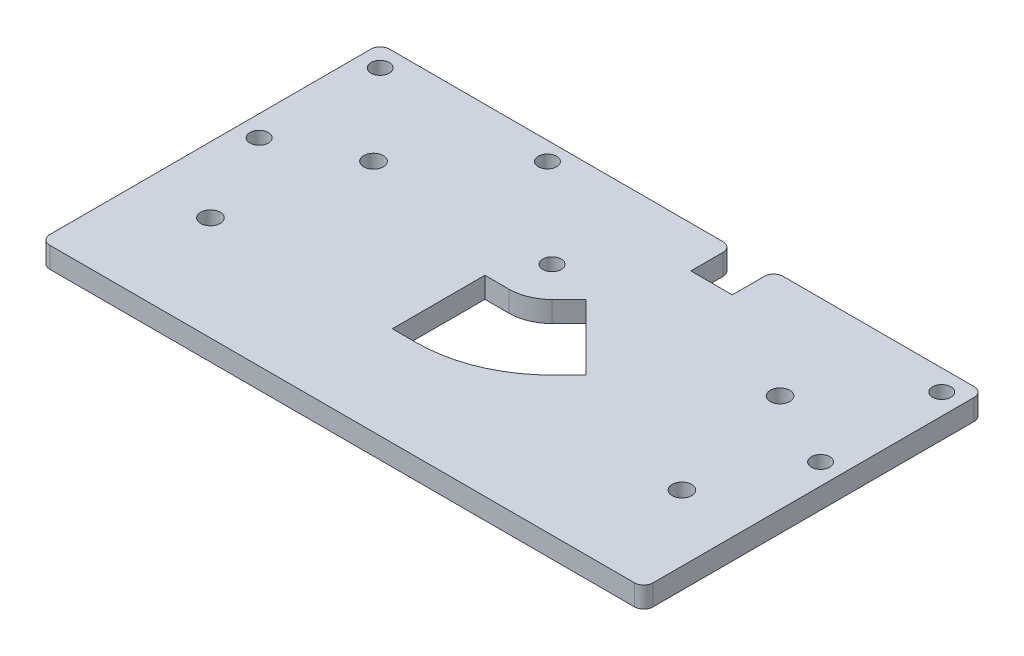
ISO-10303-21;
HEADER;
FILE_DESCRIPTION(('STEP AP214'),'2;1');
FILE_NAME('part.step','',(''),(''),'','','');
FILE_SCHEMA(('AUTOMOTIVE_DESIGN { 1 0 10303 214 1 1 1 1 }'));
ENDSEC;
DATA;
#1=APPLICATION_CONTEXT('core data for automotive mechanical design processes');
#2=APPLICATION_PROTOCOL_DEFINITION('international standard','automotive_design',2000,#1);
#3=PRODUCT_CONTEXT('',#1,'mechanical');
#4=PRODUCT('Part','Part','',(#3));
#5=PRODUCT_RELATED_PRODUCT_CATEGORY('part','',(#4));
#6=PRODUCT_DEFINITION_FORMATION('','',#4);
#7=PRODUCT_DEFINITION_CONTEXT('part definition',#1,'design');
#8=PRODUCT_DEFINITION('design','',#6,#7);
#9=PRODUCT_DEFINITION_SHAPE('','',#8);
#10=(LENGTH_UNIT() NAMED_UNIT(*) SI_UNIT(.MILLI.,.METRE.));
#11=(NAMED_UNIT(*) PLANE_ANGLE_UNIT() SI_UNIT($,.RADIAN.));
#12=(NAMED_UNIT(*) SI_UNIT($,.STERADIAN.) SOLID_ANGLE_UNIT());
#13=UNCERTAINTY_MEASURE_WITH_UNIT(LENGTH_MEASURE(1.E-05),#10,'distance_accuracy_value','');
#14=(GEOMETRIC_REPRESENTATION_CONTEXT(3) GLOBAL_UNCERTAINTY_ASSIGNED_CONTEXT((#13)) GLOBAL_UNIT_ASSIGNED_CONTEXT((#10,
#11,#12)) REPRESENTATION_CONTEXT('',''));
#15=CARTESIAN_POINT('',(0.,0.,0.));
#16=DIRECTION('',(0.,0.,1.));
#17=DIRECTION('',(1.,0.,0.));
#18=AXIS2_PLACEMENT_3D('',#15,#16,#17);
#19=CARTESIAN_POINT('',(8.86999999999997,4.5,-18.3));
#20=DIRECTION('',(0.,1.,0.));
#21=DIRECTION('',(0.,0.,1.));
#22=AXIS2_PLACEMENT_3D('',#19,#20,#21);
#23=PLANE('',#22);
#24=CARTESIAN_POINT('',(43.8023,4.5,2.33965152443093));
#25=DIRECTION('',(0.,1.,0.));
#26=DIRECTION('',(0.,0.,-1.));
#27=AXIS2_PLACEMENT_3D('',#24,#25,#26);
#28=CIRCLE('',#27,2.1082);
#29=CARTESIAN_POINT('',(43.8023,4.5,0.231451524430932));
#30=VERTEX_POINT('',#29);
#31=EDGE_CURVE('E247',#30,#30,#28,.T.);
#32=ORIENTED_EDGE('',*,*,#31,.F.);
#33=EDGE_LOOP('',(#32));
#34=FACE_BOUND('',#33,.T.);
#35=CARTESIAN_POINT('',(50.8,4.5,30.4844999999999));
#36=DIRECTION('',(0.,1.,0.));
#37=DIRECTION('',(0.,0.,-1.));
#38=AXIS2_PLACEMENT_3D('',#35,#36,#37);
#39=CIRCLE('',#38,2.10819999999999);
#40=CARTESIAN_POINT('',(50.8,4.5,28.3763));
#41=VERTEX_POINT('',#40);
#42=EDGE_CURVE('E259',#41,#41,#39,.T.);
#43=ORIENTED_EDGE('',*,*,#42,.F.);
#44=EDGE_LOOP('',(#43));
#45=FACE_BOUND('',#44,.T.);
#46=CARTESIAN_POINT('',(-5.32832484201151,4.5,2.33965152443094));
#47=DIRECTION('',(0.,1.,0.));
#48=DIRECTION('',(0.,0.,1.));
#49=AXIS2_PLACEMENT_3D('',#46,#47,#48);
#50=CIRCLE('',#49,1.975);
#51=CARTESIAN_POINT('',(-5.32832484201151,4.5,4.31465152443094));
#52=VERTEX_POINT('',#51);
#53=EDGE_CURVE('E271',#52,#52,#50,.T.);
#54=ORIENTED_EDGE('',*,*,#53,.F.);
#55=EDGE_LOOP('',(#54));
#56=FACE_BOUND('',#55,.T.);
#57=CARTESIAN_POINT('',(-60.5,4.5,10.3));
#58=DIRECTION('',(0.,1.,0.));
#59=DIRECTION('',(0.,0.,-1.));
#60=AXIS2_PLACEMENT_3D('',#57,#58,#59);
#61=CIRCLE('',#60,1.975);
#62=CARTESIAN_POINT('',(-60.5,4.5,8.32500000000002));
#63=VERTEX_POINT('',#62);
#64=EDGE_CURVE('E283',#63,#63,#61,.T.);
#65=ORIENTED_EDGE('',*,*,#64,.F.);
#66=EDGE_LOOP('',(#65));
#67=FACE_BOUND('',#66,.T.);
#68=CARTESIAN_POINT('',(60.5,4.5,-15.8));
#69=DIRECTION('',(0.,1.,0.));
#70=DIRECTION('',(0.,0.,-1.));
#71=AXIS2_PLACEMENT_3D('',#68,#69,#70);
#72=CIRCLE('',#71,1.975);
#73=CARTESIAN_POINT('',(60.5,4.5,-17.775));
#74=VERTEX_POINT('',#73);
#75=EDGE_CURVE('E295',#74,#74,#72,.T.);
#76=ORIENTED_EDGE('',*,*,#75,.F.);
#77=EDGE_LOOP('',(#76));
#78=FACE_BOUND('',#77,.T.);
#79=DIRECTION('',(0.,0.,1.));
#80=VECTOR('',#79,1.);
#81=CARTESIAN_POINT('',(19.8,4.5,-18.3));
#82=LINE('',#81,#80);
#83=CARTESIAN_POINT('',(19.8,4.5,-18.3));
#84=VERTEX_POINT('',#83);
#85=CARTESIAN_POINT('',(19.8,4.5,-11.37));
#86=VERTEX_POINT('',#85);
#87=EDGE_CURVE('E307',#84,#86,#82,.T.);
#88=ORIENTED_EDGE('',*,*,#87,.T.);
#89=DIRECTION('',(-1.,0.,0.));
#90=VECTOR('',#89,1.);
#91=CARTESIAN_POINT('',(10.87,4.5,-11.37));
#92=LINE('',#91,#90);
#93=CARTESIAN_POINT('',(10.87,4.5,-11.37));
#94=VERTEX_POINT('',#93);
#95=EDGE_CURVE('E310',#86,#94,#92,.T.);
#96=ORIENTED_EDGE('',*,*,#95,.T.);
#97=DIRECTION('',(0.,0.,-1.));
#98=VECTOR('',#97,1.);
#99=CARTESIAN_POINT('',(10.87,4.5,-18.3));
#100=LINE('',#99,#98);
#101=CARTESIAN_POINT('',(10.87,4.5,-18.3));
#102=VERTEX_POINT('',#101);
#103=EDGE_CURVE('E313',#94,#102,#100,.T.);
#104=ORIENTED_EDGE('',*,*,#103,.T.);
#105=CARTESIAN_POINT('',(8.86999999999997,4.5,-18.3));
#106=DIRECTION('',(0.,1.,0.));
#107=DIRECTION('',(0.,0.,1.));
#108=AXIS2_PLACEMENT_3D('',#105,#106,#107);
#109=CIRCLE('',#108,2.00000000000002);
#110=CARTESIAN_POINT('',(8.86999999999997,4.5,-20.3));
#111=VERTEX_POINT('',#110);
#112=EDGE_CURVE('E315',#102,#111,#109,.T.);
#113=ORIENTED_EDGE('',*,*,#112,.T.);
#114=DIRECTION('',(-1.,0.,0.));
#115=VECTOR('',#114,1.);
#116=CARTESIAN_POINT('',(8.86999999999997,4.5,-20.3));
#117=LINE('',#116,#115);
#118=CARTESIAN_POINT('',(-63.,4.5,-20.3));
#119=VERTEX_POINT('',#118);
#120=EDGE_CURVE('E317',#111,#119,#117,.T.);
#121=ORIENTED_EDGE('',*,*,#120,.T.);
#122=CARTESIAN_POINT('',(-63.,4.5,-18.3));
#123=DIRECTION('',(0.,1.,0.));
#124=DIRECTION('',(0.,0.,1.));
#125=AXIS2_PLACEMENT_3D('',#122,#123,#124);
#126=CIRCLE('',#125,2.);
#127=CARTESIAN_POINT('',(-65.,4.5,-18.3));
#128=VERTEX_POINT('',#127);
#129=EDGE_CURVE('E319',#119,#128,#126,.T.);
#130=ORIENTED_EDGE('',*,*,#129,.T.);
#131=DIRECTION('',(0.,0.,1.));
#132=VECTOR('',#131,1.);
#133=CARTESIAN_POINT('',(-65.,4.5,-18.3));
#134=LINE('',#133,#132);
#135=CARTESIAN_POINT('',(-65.,4.5,50.9));
#136=VERTEX_POINT('',#135);
#137=EDGE_CURVE('E321',#128,#136,#134,.T.);
#138=ORIENTED_EDGE('',*,*,#137,.T.);
#139=CARTESIAN_POINT('',(-63.,4.5,50.9));
#140=DIRECTION('',(0.,1.,0.));
#141=DIRECTION('',(0.,0.,-1.));
#142=AXIS2_PLACEMENT_3D('',#139,#140,#141);
#143=CIRCLE('',#142,2.);
#144=CARTESIAN_POINT('',(-63.,4.5,52.9));
#145=VERTEX_POINT('',#144);
#146=EDGE_CURVE('E323',#136,#145,#143,.T.);
#147=ORIENTED_EDGE('',*,*,#146,.T.);
#148=DIRECTION('',(1.,0.,0.));
#149=VECTOR('',#148,1.);
#150=CARTESIAN_POINT('',(63.,4.5,52.8999999999999));
#151=LINE('',#150,#149);
#152=CARTESIAN_POINT('',(63.,4.5,52.8999999999999));
#153=VERTEX_POINT('',#152);
#154=EDGE_CURVE('E325',#145,#153,#151,.T.);
#155=ORIENTED_EDGE('',*,*,#154,.T.);
#156=CARTESIAN_POINT('',(63.,4.5,50.8999999999999));
#157=DIRECTION('',(0.,1.,0.));
#158=DIRECTION('',(0.,0.,-1.));
#159=AXIS2_PLACEMENT_3D('',#156,#157,#158);
#160=CIRCLE('',#159,2.);
#161=CARTESIAN_POINT('',(65.,4.5,50.8999999999999));
#162=VERTEX_POINT('',#161);
#163=EDGE_CURVE('E327',#153,#162,#160,.T.);
#164=ORIENTED_EDGE('',*,*,#163,.T.);
#165=DIRECTION('',(0.,0.,-1.));
#166=VECTOR('',#165,1.);
#167=CARTESIAN_POINT('',(65.,4.5,-18.3));
#168=LINE('',#167,#166);
#169=CARTESIAN_POINT('',(65.,4.5,-18.3));
#170=VERTEX_POINT('',#169);
#171=EDGE_CURVE('E329',#162,#170,#168,.T.);
#172=ORIENTED_EDGE('',*,*,#171,.T.);
#173=CARTESIAN_POINT('',(63.,4.5,-18.3));
#174=DIRECTION('',(0.,1.,0.));
#175=DIRECTION('',(0.,0.,-1.));
#176=AXIS2_PLACEMENT_3D('',#173,#174,#175);
#177=CIRCLE('',#176,2.);
#178=CARTESIAN_POINT('',(63.,4.5,-20.3));
#179=VERTEX_POINT('',#178);
#180=EDGE_CURVE('E331',#170,#179,#177,.T.);
#181=ORIENTED_EDGE('',*,*,#180,.T.);
#182=DIRECTION('',(-1.,0.,0.));
#183=VECTOR('',#182,1.);
#184=CARTESIAN_POINT('',(63.,4.5,-20.3));
#185=LINE('',#184,#183);
#186=CARTESIAN_POINT('',(21.8,4.5,-20.3));
#187=VERTEX_POINT('',#186);
#188=EDGE_CURVE('E333',#179,#187,#185,.T.);
#189=ORIENTED_EDGE('',*,*,#188,.T.);
#190=CARTESIAN_POINT('',(21.8,4.5,-18.3));
#191=DIRECTION('',(0.,1.,0.));
#192=DIRECTION('',(0.,0.,1.));
#193=AXIS2_PLACEMENT_3D('',#190,#191,#192);
#194=CIRCLE('',#193,2.00000000000002);
#195=EDGE_CURVE('E335',#187,#84,#194,.T.);
#196=ORIENTED_EDGE('',*,*,#195,.T.);
#197=EDGE_LOOP('',(#88,#96,#104,#113,#121,#130,#138,#147,#155,#164,#172,#181,#189,#196));
#198=FACE_BOUND('',#197,.T.);
#199=CARTESIAN_POINT('',(-60.5,4.5,-15.8));
#200=DIRECTION('',(0.,1.,0.));
#201=DIRECTION('',(0.,0.,1.));
#202=AXIS2_PLACEMENT_3D('',#199,#200,#201);
#203=CIRCLE('',#202,1.97499999999998);
#204=CARTESIAN_POINT('',(-60.5,4.5,-13.825));
#205=VERTEX_POINT('',#204);
#206=EDGE_CURVE('E301',#205,#205,#203,.T.);
#207=ORIENTED_EDGE('',*,*,#206,.F.);
#208=EDGE_LOOP('',(#207));
#209=FACE_BOUND('',#208,.T.);
#210=CARTESIAN_POINT('',(60.5,4.5,10.3));
#211=DIRECTION('',(0.,1.,0.));
#212=DIRECTION('',(0.,0.,1.));
#213=AXIS2_PLACEMENT_3D('',#210,#211,#212);
#214=CIRCLE('',#213,1.975);
#215=CARTESIAN_POINT('',(60.5,4.5,12.275));
#216=VERTEX_POINT('',#215);
#217=EDGE_CURVE('E289',#216,#216,#214,.T.);
#218=ORIENTED_EDGE('',*,*,#217,.F.);
#219=EDGE_LOOP('',(#218));
#220=FACE_BOUND('',#219,.T.);
#221=CARTESIAN_POINT('',(-25.0042608190786,4.5,-16.35));
#222=DIRECTION('',(0.,1.,0.));
#223=DIRECTION('',(0.,0.,1.));
#224=AXIS2_PLACEMENT_3D('',#221,#222,#223);
#225=CIRCLE('',#224,1.97499999999998);
#226=CARTESIAN_POINT('',(-25.0042608190786,4.5,-14.375));
#227=VERTEX_POINT('',#226);
#228=EDGE_CURVE('E277',#227,#227,#225,.T.);
#229=ORIENTED_EDGE('',*,*,#228,.F.);
#230=EDGE_LOOP('',(#229));
#231=FACE_BOUND('',#230,.T.);
#232=CARTESIAN_POINT('',(-50.8,4.5,30.4845));
#233=DIRECTION('',(0.,1.,0.));
#234=DIRECTION('',(0.,0.,1.));
#235=AXIS2_PLACEMENT_3D('',#232,#233,#234);
#236=CIRCLE('',#235,2.10819999999999);
#237=CARTESIAN_POINT('',(-50.8,4.5,32.5926999999999));
#238=VERTEX_POINT('',#237);
#239=EDGE_CURVE('E265',#238,#238,#236,.T.);
#240=ORIENTED_EDGE('',*,*,#239,.F.);
#241=EDGE_LOOP('',(#240));
#242=FACE_BOUND('',#241,.T.);
#243=CARTESIAN_POINT('',(-43.8023,4.5,2.33965152443094));
#244=DIRECTION('',(0.,1.,0.));
#245=DIRECTION('',(0.,0.,1.));
#246=AXIS2_PLACEMENT_3D('',#243,#244,#245);
#247=CIRCLE('',#246,2.1082);
#248=CARTESIAN_POINT('',(-43.8023,4.5,4.44785152443094));
#249=VERTEX_POINT('',#248);
#250=EDGE_CURVE('E253',#249,#249,#247,.T.);
#251=ORIENTED_EDGE('',*,*,#250,.F.);
#252=EDGE_LOOP('',(#251));
#253=FACE_BOUND('',#252,.T.);
#254=DIRECTION('',(0.707106781186538,0.,-0.707106781186557));
#255=VECTOR('',#254,1.);
#256=CARTESIAN_POINT('',(15.354548507695,4.5,23.0225248741374));
#257=LINE('',#256,#255);
#258=CARTESIAN_POINT('',(15.354548507695,4.5,23.0225248741374));
#259=VERTEX_POINT('',#258);
#260=CARTESIAN_POINT('',(19.0173616342414,4.5,19.359711747591));
#261=VERTEX_POINT('',#260);
#262=EDGE_CURVE('E190',#259,#261,#257,.T.);
#263=ORIENTED_EDGE('',*,*,#262,.F.);
#264=CARTESIAN_POINT('',(-5.32832484201151,4.5,2.33965152443094));
#265=DIRECTION('',(0.,1.,0.));
#266=DIRECTION('',(0.,0.,1.));
#267=AXIS2_PLACEMENT_3D('',#264,#265,#266);
#268=CIRCLE('',#267,29.25);
#269=CARTESIAN_POINT('',(-5.32832484201151,4.5,31.5896515244309));
#270=VERTEX_POINT('',#269);
#271=EDGE_CURVE('E182',#270,#259,#268,.T.);
#272=ORIENTED_EDGE('',*,*,#271,.F.);
#273=DIRECTION('',(1.,0.,0.));
#274=VECTOR('',#273,1.);
#275=CARTESIAN_POINT('',(-5.32832484201151,4.5,31.5896515244309));
#276=LINE('',#275,#274);
#277=CARTESIAN_POINT('',(-10.5083248420115,4.5,31.5896515244309));
#278=VERTEX_POINT('',#277);
#279=EDGE_CURVE('E215',#278,#270,#276,.T.);
#280=ORIENTED_EDGE('',*,*,#279,.F.);
#281=DIRECTION('',(0.000154902687349206,0.,0.999999988002579));
#282=VECTOR('',#281,1.);
#283=CARTESIAN_POINT('',(-10.5114166996881,4.5,11.6296515244309));
#284=LINE('',#283,#282);
#285=CARTESIAN_POINT('',(-10.5114166996881,4.5,11.6296515244309));
#286=VERTEX_POINT('',#285);
#287=EDGE_CURVE('E213',#286,#278,#284,.T.);
#288=ORIENTED_EDGE('',*,*,#287,.F.);
#289=DIRECTION('',(-1.,0.,0.));
#290=VECTOR('',#289,1.);
#291=CARTESIAN_POINT('',(-5.32832484201151,4.5,11.6296515244309));
#292=LINE('',#291,#290);
#293=CARTESIAN_POINT('',(-5.32832484201151,4.5,11.6296515244309));
#294=VERTEX_POINT('',#293);
#295=EDGE_CURVE('E211',#294,#286,#292,.T.);
#296=ORIENTED_EDGE('',*,*,#295,.F.);
#297=CARTESIAN_POINT('',(-5.32832484201151,4.5,2.33965152443094));
#298=DIRECTION('',(0.,-1.,0.));
#299=DIRECTION('',(0.,0.,1.));
#300=AXIS2_PLACEMENT_3D('',#297,#298,#299);
#301=CIRCLE('',#300,9.29);
#302=CARTESIAN_POINT('',(1.24069715521153,4.5,8.90867352165396));
#303=VERTEX_POINT('',#302);
#304=EDGE_CURVE('E209',#303,#294,#301,.T.);
#305=ORIENTED_EDGE('',*,*,#304,.F.);
#306=DIRECTION('',(-0.707106781186546,0.,0.707106781186549));
#307=VECTOR('',#306,1.);
#308=CARTESIAN_POINT('',(1.24069715521153,4.5,8.90867352165396));
#309=LINE('',#308,#307);
#310=CARTESIAN_POINT('',(4.90351028175794,4.5,5.24586039510753));
#311=VERTEX_POINT('',#310);
#312=EDGE_CURVE('E205',#311,#303,#309,.T.);
#313=ORIENTED_EDGE('',*,*,#312,.F.);
#314=DIRECTION('',(-0.707106781186548,0.,-0.707106781186548));
#315=VECTOR('',#314,1.);
#316=CARTESIAN_POINT('',(4.90351028175794,4.5,5.24586039510753));
#317=LINE('',#316,#315);
#318=EDGE_CURVE('E203',#261,#311,#317,.T.);
#319=ORIENTED_EDGE('',*,*,#318,.F.);
#320=EDGE_LOOP('',(#263,#272,#280,#288,#296,#305,#313,#319));
#321=FACE_BOUND('',#320,.T.);
#322=ADVANCED_FACE('F33',(#34,#45,#56,#67,#78,#198,#209,#220,#231,#242,#253,#321),#23,.T.);
#323=CARTESIAN_POINT('',(8.86999999999997,0.,-18.3));
#324=DIRECTION('',(0.,1.,0.));
#325=DIRECTION('',(0.,0.,1.));
#326=AXIS2_PLACEMENT_3D('',#323,#324,#325);
#327=PLANE('',#326);
#328=CARTESIAN_POINT('',(43.8023,0.,2.33965152443093));
#329=DIRECTION('',(0.,1.,0.));
#330=DIRECTION('',(0.,0.,-1.));
#331=AXIS2_PLACEMENT_3D('',#328,#329,#330);
#332=CIRCLE('',#331,2.1082);
#333=CARTESIAN_POINT('',(43.8023,0.,0.231451524430932));
#334=VERTEX_POINT('',#333);
#335=EDGE_CURVE('E198',#334,#334,#332,.T.);
#336=ORIENTED_EDGE('',*,*,#335,.T.);
#337=EDGE_LOOP('',(#336));
#338=FACE_BOUND('',#337,.T.);
#339=CARTESIAN_POINT('',(50.8,0.,30.4844999999999));
#340=DIRECTION('',(0.,1.,0.));
#341=DIRECTION('',(0.,0.,-1.));
#342=AXIS2_PLACEMENT_3D('',#339,#340,#341);
#343=CIRCLE('',#342,2.10819999999999);
#344=CARTESIAN_POINT('',(50.8,0.,28.3763));
#345=VERTEX_POINT('',#344);
#346=EDGE_CURVE('E256',#345,#345,#343,.T.);
#347=ORIENTED_EDGE('',*,*,#346,.T.);
#348=EDGE_LOOP('',(#347));
#349=FACE_BOUND('',#348,.T.);
#350=CARTESIAN_POINT('',(-5.32832484201151,0.,2.33965152443094));
#351=DIRECTION('',(0.,1.,0.));
#352=DIRECTION('',(0.,0.,1.));
#353=AXIS2_PLACEMENT_3D('',#350,#351,#352);
#354=CIRCLE('',#353,1.975);
#355=CARTESIAN_POINT('',(-5.32832484201151,0.,4.31465152443094));
#356=VERTEX_POINT('',#355);
#357=EDGE_CURVE('E268',#356,#356,#354,.T.);
#358=ORIENTED_EDGE('',*,*,#357,.T.);
#359=EDGE_LOOP('',(#358));
#360=FACE_BOUND('',#359,.T.);
#361=CARTESIAN_POINT('',(-60.5,0.,10.3));
#362=DIRECTION('',(0.,1.,0.));
#363=DIRECTION('',(0.,0.,-1.));
#364=AXIS2_PLACEMENT_3D('',#361,#362,#363);
#365=CIRCLE('',#364,1.975);
#366=CARTESIAN_POINT('',(-60.5,0.,8.32500000000002));
#367=VERTEX_POINT('',#366);
#368=EDGE_CURVE('E280',#367,#367,#365,.T.);
#369=ORIENTED_EDGE('',*,*,#368,.T.);
#370=EDGE_LOOP('',(#369));
#371=FACE_BOUND('',#370,.T.);
#372=CARTESIAN_POINT('',(60.5,0.,-15.8));
#373=DIRECTION('',(0.,1.,0.));
#374=DIRECTION('',(0.,0.,-1.));
#375=AXIS2_PLACEMENT_3D('',#372,#373,#374);
#376=CIRCLE('',#375,1.975);
#377=CARTESIAN_POINT('',(60.5,0.,-17.775));
#378=VERTEX_POINT('',#377);
#379=EDGE_CURVE('E292',#378,#378,#376,.T.);
#380=ORIENTED_EDGE('',*,*,#379,.T.);
#381=EDGE_LOOP('',(#380));
#382=FACE_BOUND('',#381,.T.);
#383=DIRECTION('',(0.,0.,1.));
#384=VECTOR('',#383,1.);
#385=CARTESIAN_POINT('',(19.8,0.,-18.3));
#386=LINE('',#385,#384);
#387=CARTESIAN_POINT('',(19.8,0.,-18.3));
#388=VERTEX_POINT('',#387);
#389=CARTESIAN_POINT('',(19.8,0.,-11.37));
#390=VERTEX_POINT('',#389);
#391=EDGE_CURVE('E304',#388,#390,#386,.T.);
#392=ORIENTED_EDGE('',*,*,#391,.F.);
#393=CARTESIAN_POINT('',(21.8,0.,-18.3));
#394=DIRECTION('',(0.,1.,0.));
#395=DIRECTION('',(0.,0.,1.));
#396=AXIS2_PLACEMENT_3D('',#393,#394,#395);
#397=CIRCLE('',#396,2.00000000000002);
#398=CARTESIAN_POINT('',(21.8,0.,-20.3));
#399=VERTEX_POINT('',#398);
#400=EDGE_CURVE('E311',#399,#388,#397,.T.);
#401=ORIENTED_EDGE('',*,*,#400,.F.);
#402=DIRECTION('',(-1.,0.,0.));
#403=VECTOR('',#402,1.);
#404=CARTESIAN_POINT('',(63.,0.,-20.3));
#405=LINE('',#404,#403);
#406=CARTESIAN_POINT('',(63.,0.,-20.3));
#407=VERTEX_POINT('',#406);
#408=EDGE_CURVE('E362',#407,#399,#405,.T.);
#409=ORIENTED_EDGE('',*,*,#408,.F.);
#410=CARTESIAN_POINT('',(63.,0.,-18.3));
#411=DIRECTION('',(0.,1.,0.));
#412=DIRECTION('',(0.,0.,-1.));
#413=AXIS2_PLACEMENT_3D('',#410,#411,#412);
#414=CIRCLE('',#413,2.);
#415=CARTESIAN_POINT('',(65.,0.,-18.3));
#416=VERTEX_POINT('',#415);
#417=EDGE_CURVE('E360',#416,#407,#414,.T.);
#418=ORIENTED_EDGE('',*,*,#417,.F.);
#419=DIRECTION('',(0.,0.,-1.));
#420=VECTOR('',#419,1.);
#421=CARTESIAN_POINT('',(65.,0.,-18.3));
#422=LINE('',#421,#420);
#423=CARTESIAN_POINT('',(65.,0.,50.8999999999999));
#424=VERTEX_POINT('',#423);
#425=EDGE_CURVE('E358',#424,#416,#422,.T.);
#426=ORIENTED_EDGE('',*,*,#425,.F.);
#427=CARTESIAN_POINT('',(63.,0.,50.8999999999999));
#428=DIRECTION('',(0.,1.,0.));
#429=DIRECTION('',(0.,0.,-1.));
#430=AXIS2_PLACEMENT_3D('',#427,#428,#429);
#431=CIRCLE('',#430,2.);
#432=CARTESIAN_POINT('',(63.,0.,52.8999999999999));
#433=VERTEX_POINT('',#432);
#434=EDGE_CURVE('E356',#433,#424,#431,.T.);
#435=ORIENTED_EDGE('',*,*,#434,.F.);
#436=DIRECTION('',(1.,0.,0.));
#437=VECTOR('',#436,1.);
#438=CARTESIAN_POINT('',(63.,0.,52.8999999999999));
#439=LINE('',#438,#437);
#440=CARTESIAN_POINT('',(-63.,0.,52.9));
#441=VERTEX_POINT('',#440);
#442=EDGE_CURVE('E354',#441,#433,#439,.T.);
#443=ORIENTED_EDGE('',*,*,#442,.F.);
#444=CARTESIAN_POINT('',(-63.,0.,50.9));
#445=DIRECTION('',(0.,1.,0.));
#446=DIRECTION('',(0.,0.,-1.));
#447=AXIS2_PLACEMENT_3D('',#444,#445,#446);
#448=CIRCLE('',#447,2.);
#449=CARTESIAN_POINT('',(-65.,0.,50.9));
#450=VERTEX_POINT('',#449);
#451=EDGE_CURVE('E352',#450,#441,#448,.T.);
#452=ORIENTED_EDGE('',*,*,#451,.F.);
#453=DIRECTION('',(0.,0.,1.));
#454=VECTOR('',#453,1.);
#455=CARTESIAN_POINT('',(-65.,0.,-18.3));
#456=LINE('',#455,#454);
#457=CARTESIAN_POINT('',(-65.,0.,-18.3));
#458=VERTEX_POINT('',#457);
#459=EDGE_CURVE('E350',#458,#450,#456,.T.);
#460=ORIENTED_EDGE('',*,*,#459,.F.);
#461=CARTESIAN_POINT('',(-63.,0.,-18.3));
#462=DIRECTION('',(0.,1.,0.));
#463=DIRECTION('',(0.,0.,1.));
#464=AXIS2_PLACEMENT_3D('',#461,#462,#463);
#465=CIRCLE('',#464,2.);
#466=CARTESIAN_POINT('',(-63.,0.,-20.3));
#467=VERTEX_POINT('',#466);
#468=EDGE_CURVE('E348',#467,#458,#465,.T.);
#469=ORIENTED_EDGE('',*,*,#468,.F.);
#470=DIRECTION('',(-1.,0.,0.));
#471=VECTOR('',#470,1.);
#472=CARTESIAN_POINT('',(8.86999999999997,0.,-20.3));
#473=LINE('',#472,#471);
#474=CARTESIAN_POINT('',(8.86999999999997,0.,-20.3));
#475=VERTEX_POINT('',#474);
#476=EDGE_CURVE('E346',#475,#467,#473,.T.);
#477=ORIENTED_EDGE('',*,*,#476,.F.);
#478=CARTESIAN_POINT('',(8.86999999999997,0.,-18.3));
#479=DIRECTION('',(0.,1.,0.));
#480=DIRECTION('',(0.,0.,1.));
#481=AXIS2_PLACEMENT_3D('',#478,#479,#480);
#482=CIRCLE('',#481,2.00000000000002);
#483=CARTESIAN_POINT('',(10.87,0.,-18.3));
#484=VERTEX_POINT('',#483);
#485=EDGE_CURVE('E344',#484,#475,#482,.T.);
#486=ORIENTED_EDGE('',*,*,#485,.F.);
#487=DIRECTION('',(0.,0.,-1.));
#488=VECTOR('',#487,1.);
#489=CARTESIAN_POINT('',(10.87,0.,-18.3));
#490=LINE('',#489,#488);
#491=CARTESIAN_POINT('',(10.87,0.,-11.37));
#492=VERTEX_POINT('',#491);
#493=EDGE_CURVE('E342',#492,#484,#490,.T.);
#494=ORIENTED_EDGE('',*,*,#493,.F.);
#495=DIRECTION('',(-1.,0.,0.));
#496=VECTOR('',#495,1.);
#497=CARTESIAN_POINT('',(10.87,0.,-11.37));
#498=LINE('',#497,#496);
#499=EDGE_CURVE('E340',#390,#492,#498,.T.);
#500=ORIENTED_EDGE('',*,*,#499,.F.);
#501=EDGE_LOOP('',(#392,#401,#409,#418,#426,#435,#443,#452,#460,#469,#477,#486,#494,#500));
#502=FACE_BOUND('',#501,.T.);
#503=CARTESIAN_POINT('',(-60.5,0.,-15.8));
#504=DIRECTION('',(0.,1.,0.));
#505=DIRECTION('',(0.,0.,1.));
#506=AXIS2_PLACEMENT_3D('',#503,#504,#505);
#507=CIRCLE('',#506,1.97499999999998);
#508=CARTESIAN_POINT('',(-60.5,0.,-13.825));
#509=VERTEX_POINT('',#508);
#510=EDGE_CURVE('E298',#509,#509,#507,.T.);
#511=ORIENTED_EDGE('',*,*,#510,.T.);
#512=EDGE_LOOP('',(#511));
#513=FACE_BOUND('',#512,.T.);
#514=CARTESIAN_POINT('',(60.5,0.,10.3));
#515=DIRECTION('',(0.,1.,0.));
#516=DIRECTION('',(0.,0.,1.));
#517=AXIS2_PLACEMENT_3D('',#514,#515,#516);
#518=CIRCLE('',#517,1.975);
#519=CARTESIAN_POINT('',(60.5,0.,12.275));
#520=VERTEX_POINT('',#519);
#521=EDGE_CURVE('E286',#520,#520,#518,.T.);
#522=ORIENTED_EDGE('',*,*,#521,.T.);
#523=EDGE_LOOP('',(#522));
#524=FACE_BOUND('',#523,.T.);
#525=CARTESIAN_POINT('',(-25.0042608190786,0.,-16.35));
#526=DIRECTION('',(0.,1.,0.));
#527=DIRECTION('',(0.,0.,1.));
#528=AXIS2_PLACEMENT_3D('',#525,#526,#527);
#529=CIRCLE('',#528,1.97499999999998);
#530=CARTESIAN_POINT('',(-25.0042608190786,0.,-14.375));
#531=VERTEX_POINT('',#530);
#532=EDGE_CURVE('E274',#531,#531,#529,.T.);
#533=ORIENTED_EDGE('',*,*,#532,.T.);
#534=EDGE_LOOP('',(#533));
#535=FACE_BOUND('',#534,.T.);
#536=CARTESIAN_POINT('',(-50.8,0.,30.4845));
#537=DIRECTION('',(0.,1.,0.));
#538=DIRECTION('',(0.,0.,1.));
#539=AXIS2_PLACEMENT_3D('',#536,#537,#538);
#540=CIRCLE('',#539,2.10819999999999);
#541=CARTESIAN_POINT('',(-50.8,0.,32.5926999999999));
#542=VERTEX_POINT('',#541);
#543=EDGE_CURVE('E262',#542,#542,#540,.T.);
#544=ORIENTED_EDGE('',*,*,#543,.T.);
#545=EDGE_LOOP('',(#544));
#546=FACE_BOUND('',#545,.T.);
#547=CARTESIAN_POINT('',(-43.8023,0.,2.33965152443094));
#548=DIRECTION('',(0.,1.,0.));
#549=DIRECTION('',(0.,0.,1.));
#550=AXIS2_PLACEMENT_3D('',#547,#548,#549);
#551=CIRCLE('',#550,2.1082);
#552=CARTESIAN_POINT('',(-43.8023,0.,4.44785152443094));
#553=VERTEX_POINT('',#552);
#554=EDGE_CURVE('E250',#553,#553,#551,.T.);
#555=ORIENTED_EDGE('',*,*,#554,.T.);
#556=EDGE_LOOP('',(#555));
#557=FACE_BOUND('',#556,.T.);
#558=CARTESIAN_POINT('',(-5.32832484201151,0.,2.33965152443094));
#559=DIRECTION('',(0.,1.,0.));
#560=DIRECTION('',(0.,0.,1.));
#561=AXIS2_PLACEMENT_3D('',#558,#559,#560);
#562=CIRCLE('',#561,29.25);
#563=CARTESIAN_POINT('',(-5.32832484201151,0.,31.5896515244309));
#564=VERTEX_POINT('',#563);
#565=CARTESIAN_POINT('',(15.354548507695,0.,23.0225248741374));
#566=VERTEX_POINT('',#565);
#567=EDGE_CURVE('E56',#564,#566,#562,.T.);
#568=ORIENTED_EDGE('',*,*,#567,.T.);
#569=DIRECTION('',(0.707106781186538,0.,-0.707106781186557));
#570=VECTOR('',#569,1.);
#571=CARTESIAN_POINT('',(15.354548507695,0.,23.0225248741374));
#572=LINE('',#571,#570);
#573=CARTESIAN_POINT('',(19.0173616342414,0.,19.359711747591));
#574=VERTEX_POINT('',#573);
#575=EDGE_CURVE('E197',#566,#574,#572,.T.);
#576=ORIENTED_EDGE('',*,*,#575,.T.);
#577=DIRECTION('',(-0.707106781186548,0.,-0.707106781186548));
#578=VECTOR('',#577,1.);
#579=CARTESIAN_POINT('',(4.90351028175794,0.,5.24586039510753));
#580=LINE('',#579,#578);
#581=CARTESIAN_POINT('',(4.90351028175794,0.,5.24586039510753));
#582=VERTEX_POINT('',#581);
#583=EDGE_CURVE('E219',#574,#582,#580,.T.);
#584=ORIENTED_EDGE('',*,*,#583,.T.);
#585=DIRECTION('',(-0.707106781186546,0.,0.707106781186549));
#586=VECTOR('',#585,1.);
#587=CARTESIAN_POINT('',(1.24069715521153,0.,8.90867352165396));
#588=LINE('',#587,#586);
#589=CARTESIAN_POINT('',(1.24069715521153,0.,8.90867352165396));
#590=VERTEX_POINT('',#589);
#591=EDGE_CURVE('E222',#582,#590,#588,.T.);
#592=ORIENTED_EDGE('',*,*,#591,.T.);
#593=CARTESIAN_POINT('',(-5.32832484201151,0.,2.33965152443094));
#594=DIRECTION('',(0.,-1.,0.));
#595=DIRECTION('',(0.,0.,1.));
#596=AXIS2_PLACEMENT_3D('',#593,#594,#595);
#597=CIRCLE('',#596,9.29);
#598=CARTESIAN_POINT('',(-5.32832484201151,0.,11.6296515244309));
#599=VERTEX_POINT('',#598);
#600=EDGE_CURVE('E225',#590,#599,#597,.T.);
#601=ORIENTED_EDGE('',*,*,#600,.T.);
#602=DIRECTION('',(-1.,0.,0.));
#603=VECTOR('',#602,1.);
#604=CARTESIAN_POINT('',(-5.32832484201151,0.,11.6296515244309));
#605=LINE('',#604,#603);
#606=CARTESIAN_POINT('',(-10.5114166996881,0.,11.6296515244309));
#607=VERTEX_POINT('',#606);
#608=EDGE_CURVE('E228',#599,#607,#605,.T.);
#609=ORIENTED_EDGE('',*,*,#608,.T.);
#610=DIRECTION('',(0.000154902687349206,0.,0.999999988002579));
#611=VECTOR('',#610,1.);
#612=CARTESIAN_POINT('',(-10.5114166996881,0.,11.6296515244309));
#613=LINE('',#612,#611);
#614=CARTESIAN_POINT('',(-10.5083248420115,0.,31.5896515244309));
#615=VERTEX_POINT('',#614);
#616=EDGE_CURVE('E231',#607,#615,#613,.T.);
#617=ORIENTED_EDGE('',*,*,#616,.T.);
#618=DIRECTION('',(1.,0.,0.));
#619=VECTOR('',#618,1.);
#620=CARTESIAN_POINT('',(-5.32832484201151,0.,31.5896515244309));
#621=LINE('',#620,#619);
#622=EDGE_CURVE('E191',#615,#564,#621,.T.);
#623=ORIENTED_EDGE('',*,*,#622,.T.);
#624=EDGE_LOOP('',(#568,#576,#584,#592,#601,#609,#617,#623));
#625=FACE_BOUND('',#624,.T.);
#626=ADVANCED_FACE('F410',(#338,#349,#360,#371,#382,#502,#513,#524,#535,#546,#557,#625),#327,.F.);
#627=CARTESIAN_POINT('',(19.8,4.5,-18.3));
#628=DIRECTION('',(1.,0.,0.));
#629=DIRECTION('',(0.,0.,-1.));
#630=AXIS2_PLACEMENT_3D('',#627,#628,#629);
#631=PLANE('',#630);
#632=ORIENTED_EDGE('',*,*,#391,.T.);
#633=DIRECTION('',(0.,-1.,0.));
#634=VECTOR('',#633,1.);
#635=CARTESIAN_POINT('',(19.8,4.5,-11.37));
#636=LINE('',#635,#634);
#637=EDGE_CURVE('E11',#86,#390,#636,.T.);
#638=ORIENTED_EDGE('',*,*,#637,.F.);
#639=ORIENTED_EDGE('',*,*,#87,.F.);
#640=DIRECTION('',(0.,-1.,0.));
#641=VECTOR('',#640,1.);
#642=CARTESIAN_POINT('',(19.8,4.5,-18.3));
#643=LINE('',#642,#641);
#644=EDGE_CURVE('E337',#84,#388,#643,.T.);
#645=ORIENTED_EDGE('',*,*,#644,.T.);
#646=EDGE_LOOP('',(#632,#638,#639,#645));
#647=FACE_BOUND('',#646,.T.);
#648=ADVANCED_FACE('F35',(#647),#631,.F.);
#649=CARTESIAN_POINT('',(10.87,4.5,-11.37));
#650=DIRECTION('',(0.,0.,1.));
#651=DIRECTION('',(1.,0.,0.));
#652=AXIS2_PLACEMENT_3D('',#649,#650,#651);
#653=PLANE('',#652);
#654=ORIENTED_EDGE('',*,*,#499,.T.);
#655=DIRECTION('',(0.,-1.,0.));
#656=VECTOR('',#655,1.);
#657=CARTESIAN_POINT('',(10.87,4.5,-11.37));
#658=LINE('',#657,#656);
#659=EDGE_CURVE('E41',#94,#492,#658,.T.);
#660=ORIENTED_EDGE('',*,*,#659,.F.);
#661=ORIENTED_EDGE('',*,*,#95,.F.);
#662=ORIENTED_EDGE('',*,*,#637,.T.);
#663=EDGE_LOOP('',(#654,#660,#661,#662));
#664=FACE_BOUND('',#663,.T.);
#665=ADVANCED_FACE('F428',(#664),#653,.F.);
#666=CARTESIAN_POINT('',(10.87,4.5,-18.3));
#667=DIRECTION('',(-1.,0.,0.));
#668=DIRECTION('',(0.,0.,1.));
#669=AXIS2_PLACEMENT_3D('',#666,#667,#668);
#670=PLANE('',#669);
#671=ORIENTED_EDGE('',*,*,#493,.T.);
#672=DIRECTION('',(0.,-1.,0.));
#673=VECTOR('',#672,1.);
#674=CARTESIAN_POINT('',(10.87,4.5,-18.3));
#675=LINE('',#674,#673);
#676=EDGE_CURVE('E397',#102,#484,#675,.T.);
#677=ORIENTED_EDGE('',*,*,#676,.F.);
#678=ORIENTED_EDGE('',*,*,#103,.F.);
#679=ORIENTED_EDGE('',*,*,#659,.T.);
#680=EDGE_LOOP('',(#671,#677,#678,#679));
#681=FACE_BOUND('',#680,.T.);
#682=ADVANCED_FACE('F404',(#681),#670,.F.);
#683=CARTESIAN_POINT('',(8.86999999999997,4.5,-18.3));
#684=DIRECTION('',(0.,-1.,0.));
#685=DIRECTION('',(0.,0.,-1.));
#686=AXIS2_PLACEMENT_3D('',#683,#684,#685);
#687=CYLINDRICAL_SURFACE('',#686,2.00000000000002);
#688=ORIENTED_EDGE('',*,*,#485,.T.);
#689=DIRECTION('',(0.,-1.,0.));
#690=VECTOR('',#689,1.);
#691=CARTESIAN_POINT('',(8.86999999999997,4.5,-20.3));
#692=LINE('',#691,#690);
#693=EDGE_CURVE('E394',#111,#475,#692,.T.);
#694=ORIENTED_EDGE('',*,*,#693,.F.);
#695=ORIENTED_EDGE('',*,*,#112,.F.);
#696=ORIENTED_EDGE('',*,*,#676,.T.);
#697=EDGE_LOOP('',(#688,#694,#695,#696));
#698=FACE_BOUND('',#697,.T.);
#699=ADVANCED_FACE('F416',(#698),#687,.T.);
#700=CARTESIAN_POINT('',(8.86999999999997,4.5,-20.3));
#701=DIRECTION('',(0.,0.,1.));
#702=DIRECTION('',(1.,0.,0.));
#703=AXIS2_PLACEMENT_3D('',#700,#701,#702);
#704=PLANE('',#703);
#705=ORIENTED_EDGE('',*,*,#476,.T.);
#706=DIRECTION('',(0.,-1.,0.));
#707=VECTOR('',#706,1.);
#708=CARTESIAN_POINT('',(-63.,4.5,-20.3));
#709=LINE('',#708,#707);
#710=EDGE_CURVE('E391',#119,#467,#709,.T.);
#711=ORIENTED_EDGE('',*,*,#710,.F.);
#712=ORIENTED_EDGE('',*,*,#120,.F.);
#713=ORIENTED_EDGE('',*,*,#693,.T.);
#714=EDGE_LOOP('',(#705,#711,#712,#713));
#715=FACE_BOUND('',#714,.T.);
#716=ADVANCED_FACE('F420',(#715),#704,.F.);
#717=CARTESIAN_POINT('',(-63.,4.5,-18.3));
#718=DIRECTION('',(0.,-1.,0.));
#719=DIRECTION('',(0.,0.,-1.));
#720=AXIS2_PLACEMENT_3D('',#717,#718,#719);
#721=CYLINDRICAL_SURFACE('',#720,2.);
#722=ORIENTED_EDGE('',*,*,#468,.T.);
#723=DIRECTION('',(0.,-1.,0.));
#724=VECTOR('',#723,1.);
#725=CARTESIAN_POINT('',(-65.,4.5,-18.3));
#726=LINE('',#725,#724);
#727=EDGE_CURVE('E388',#128,#458,#726,.T.);
#728=ORIENTED_EDGE('',*,*,#727,.F.);
#729=ORIENTED_EDGE('',*,*,#129,.F.);
#730=ORIENTED_EDGE('',*,*,#710,.T.);
#731=EDGE_LOOP('',(#722,#728,#729,#730));
#732=FACE_BOUND('',#731,.T.);
#733=ADVANCED_FACE('F471',(#732),#721,.T.);
#734=CARTESIAN_POINT('',(-65.,4.5,-18.3));
#735=DIRECTION('',(1.,0.,0.));
#736=DIRECTION('',(0.,0.,-1.));
#737=AXIS2_PLACEMENT_3D('',#734,#735,#736);
#738=PLANE('',#737);
#739=ORIENTED_EDGE('',*,*,#459,.T.);
#740=DIRECTION('',(0.,-1.,0.));
#741=VECTOR('',#740,1.);
#742=CARTESIAN_POINT('',(-65.,4.5,50.9));
#743=LINE('',#742,#741);
#744=EDGE_CURVE('E385',#136,#450,#743,.T.);
#745=ORIENTED_EDGE('',*,*,#744,.F.);
#746=ORIENTED_EDGE('',*,*,#137,.F.);
#747=ORIENTED_EDGE('',*,*,#727,.T.);
#748=EDGE_LOOP('',(#739,#745,#746,#747));
#749=FACE_BOUND('',#748,.T.);
#750=ADVANCED_FACE('F469',(#749),#738,.F.);
#751=CARTESIAN_POINT('',(-63.,4.5,50.9));
#752=DIRECTION('',(0.,-1.,0.));
#753=DIRECTION('',(0.,0.,-1.));
#754=AXIS2_PLACEMENT_3D('',#751,#752,#753);
#755=CYLINDRICAL_SURFACE('',#754,2.);
#756=ORIENTED_EDGE('',*,*,#451,.T.);
#757=DIRECTION('',(0.,-1.,0.));
#758=VECTOR('',#757,1.);
#759=CARTESIAN_POINT('',(-63.,4.5,52.9));
#760=LINE('',#759,#758);
#761=EDGE_CURVE('E382',#145,#441,#760,.T.);
#762=ORIENTED_EDGE('',*,*,#761,.F.);
#763=ORIENTED_EDGE('',*,*,#146,.F.);
#764=ORIENTED_EDGE('',*,*,#744,.T.);
#765=EDGE_LOOP('',(#756,#762,#763,#764));
#766=FACE_BOUND('',#765,.T.);
#767=ADVANCED_FACE('F464',(#766),#755,.T.);
#768=CARTESIAN_POINT('',(63.,4.5,52.8999999999999));
#769=DIRECTION('',(0.,0.,-1.));
#770=DIRECTION('',(-1.,0.,0.));
#771=AXIS2_PLACEMENT_3D('',#768,#769,#770);
#772=PLANE('',#771);
#773=ORIENTED_EDGE('',*,*,#442,.T.);
#774=DIRECTION('',(0.,-1.,0.));
#775=VECTOR('',#774,1.);
#776=CARTESIAN_POINT('',(63.,4.5,52.8999999999999));
#777=LINE('',#776,#775);
#778=EDGE_CURVE('E379',#153,#433,#777,.T.);
#779=ORIENTED_EDGE('',*,*,#778,.F.);
#780=ORIENTED_EDGE('',*,*,#154,.F.);
#781=ORIENTED_EDGE('',*,*,#761,.T.);
#782=EDGE_LOOP('',(#773,#779,#780,#781));
#783=FACE_BOUND('',#782,.T.);
#784=ADVANCED_FACE('F459',(#783),#772,.F.);
#785=CARTESIAN_POINT('',(63.,4.5,50.8999999999999));
#786=DIRECTION('',(0.,-1.,0.));
#787=DIRECTION('',(0.,0.,-1.));
#788=AXIS2_PLACEMENT_3D('',#785,#786,#787);
#789=CYLINDRICAL_SURFACE('',#788,2.);
#790=ORIENTED_EDGE('',*,*,#434,.T.);
#791=DIRECTION('',(0.,-1.,0.));
#792=VECTOR('',#791,1.);
#793=CARTESIAN_POINT('',(65.,4.5,50.8999999999999));
#794=LINE('',#793,#792);
#795=EDGE_CURVE('E376',#162,#424,#794,.T.);
#796=ORIENTED_EDGE('',*,*,#795,.F.);
#797=ORIENTED_EDGE('',*,*,#163,.F.);
#798=ORIENTED_EDGE('',*,*,#778,.T.);
#799=EDGE_LOOP('',(#790,#796,#797,#798));
#800=FACE_BOUND('',#799,.T.);
#801=ADVANCED_FACE('F455',(#800),#789,.T.);
#802=CARTESIAN_POINT('',(65.,4.5,-18.3));
#803=DIRECTION('',(-1.,0.,0.));
#804=DIRECTION('',(0.,0.,1.));
#805=AXIS2_PLACEMENT_3D('',#802,#803,#804);
#806=PLANE('',#805);
#807=ORIENTED_EDGE('',*,*,#425,.T.);
#808=DIRECTION('',(0.,-1.,0.));
#809=VECTOR('',#808,1.);
#810=CARTESIAN_POINT('',(65.,4.5,-18.3));
#811=LINE('',#810,#809);
#812=EDGE_CURVE('E373',#170,#416,#811,.T.);
#813=ORIENTED_EDGE('',*,*,#812,.F.);
#814=ORIENTED_EDGE('',*,*,#171,.F.);
#815=ORIENTED_EDGE('',*,*,#795,.T.);
#816=EDGE_LOOP('',(#807,#813,#814,#815));
#817=FACE_BOUND('',#816,.T.);
#818=ADVANCED_FACE('F450',(#817),#806,.F.);
#819=CARTESIAN_POINT('',(63.,4.5,-18.3));
#820=DIRECTION('',(0.,-1.,0.));
#821=DIRECTION('',(0.,0.,-1.));
#822=AXIS2_PLACEMENT_3D('',#819,#820,#821);
#823=CYLINDRICAL_SURFACE('',#822,2.);
#824=ORIENTED_EDGE('',*,*,#417,.T.);
#825=DIRECTION('',(0.,-1.,0.));
#826=VECTOR('',#825,1.);
#827=CARTESIAN_POINT('',(63.,4.5,-20.3));
#828=LINE('',#827,#826);
#829=EDGE_CURVE('E370',#179,#407,#828,.T.);
#830=ORIENTED_EDGE('',*,*,#829,.F.);
#831=ORIENTED_EDGE('',*,*,#180,.F.);
#832=ORIENTED_EDGE('',*,*,#812,.T.);
#833=EDGE_LOOP('',(#824,#830,#831,#832));
#834=FACE_BOUND('',#833,.T.);
#835=ADVANCED_FACE('F444',(#834),#823,.T.);
#836=CARTESIAN_POINT('',(63.,4.5,-20.3));
#837=DIRECTION('',(0.,0.,1.));
#838=DIRECTION('',(1.,0.,0.));
#839=AXIS2_PLACEMENT_3D('',#836,#837,#838);
#840=PLANE('',#839);
#841=ORIENTED_EDGE('',*,*,#408,.T.);
#842=DIRECTION('',(0.,-1.,0.));
#843=VECTOR('',#842,1.);
#844=CARTESIAN_POINT('',(21.8,4.5,-20.3));
#845=LINE('',#844,#843);
#846=EDGE_CURVE('E367',#187,#399,#845,.T.);
#847=ORIENTED_EDGE('',*,*,#846,.F.);
#848=ORIENTED_EDGE('',*,*,#188,.F.);
#849=ORIENTED_EDGE('',*,*,#829,.T.);
#850=EDGE_LOOP('',(#841,#847,#848,#849));
#851=FACE_BOUND('',#850,.T.);
#852=ADVANCED_FACE('F440',(#851),#840,.F.);
#853=CARTESIAN_POINT('',(21.8,4.5,-18.3));
#854=DIRECTION('',(0.,-1.,0.));
#855=DIRECTION('',(0.,0.,-1.));
#856=AXIS2_PLACEMENT_3D('',#853,#854,#855);
#857=CYLINDRICAL_SURFACE('',#856,2.00000000000002);
#858=ORIENTED_EDGE('',*,*,#400,.T.);
#859=ORIENTED_EDGE('',*,*,#644,.F.);
#860=ORIENTED_EDGE('',*,*,#195,.F.);
#861=ORIENTED_EDGE('',*,*,#846,.T.);
#862=EDGE_LOOP('',(#858,#859,#860,#861));
#863=FACE_BOUND('',#862,.T.);
#864=ADVANCED_FACE('F435',(#863),#857,.T.);
#865=CARTESIAN_POINT('',(-60.5,4.5,-15.8));
#866=DIRECTION('',(0.,-1.,0.));
#867=DIRECTION('',(0.,0.,-1.));
#868=AXIS2_PLACEMENT_3D('',#865,#866,#867);
#869=CYLINDRICAL_SURFACE('',#868,1.97499999999998);
#870=ORIENTED_EDGE('',*,*,#206,.T.);
#871=EDGE_LOOP('',(#870));
#872=FACE_BOUND('',#871,.T.);
#873=ORIENTED_EDGE('',*,*,#510,.F.);
#874=EDGE_LOOP('',(#873));
#875=FACE_BOUND('',#874,.T.);
#876=ADVANCED_FACE('F491',(#872,#875),#869,.F.);
#877=CARTESIAN_POINT('',(60.5,4.5,-15.8));
#878=DIRECTION('',(0.,-1.,0.));
#879=DIRECTION('',(0.,0.,-1.));
#880=AXIS2_PLACEMENT_3D('',#877,#878,#879);
#881=CYLINDRICAL_SURFACE('',#880,1.975);
#882=ORIENTED_EDGE('',*,*,#75,.T.);
#883=EDGE_LOOP('',(#882));
#884=FACE_BOUND('',#883,.T.);
#885=ORIENTED_EDGE('',*,*,#379,.F.);
#886=EDGE_LOOP('',(#885));
#887=FACE_BOUND('',#886,.T.);
#888=ADVANCED_FACE('F541',(#884,#887),#881,.F.);
#889=CARTESIAN_POINT('',(60.5,4.5,10.3));
#890=DIRECTION('',(0.,-1.,0.));
#891=DIRECTION('',(0.,0.,-1.));
#892=AXIS2_PLACEMENT_3D('',#889,#890,#891);
#893=CYLINDRICAL_SURFACE('',#892,1.975);
#894=ORIENTED_EDGE('',*,*,#217,.T.);
#895=EDGE_LOOP('',(#894));
#896=FACE_BOUND('',#895,.T.);
#897=ORIENTED_EDGE('',*,*,#521,.F.);
#898=EDGE_LOOP('',(#897));
#899=FACE_BOUND('',#898,.T.);
#900=ADVANCED_FACE('F548',(#896,#899),#893,.F.);
#901=CARTESIAN_POINT('',(-60.5,4.5,10.3));
#902=DIRECTION('',(0.,-1.,0.));
#903=DIRECTION('',(0.,0.,-1.));
#904=AXIS2_PLACEMENT_3D('',#901,#902,#903);
#905=CYLINDRICAL_SURFACE('',#904,1.975);
#906=ORIENTED_EDGE('',*,*,#64,.T.);
#907=EDGE_LOOP('',(#906));
#908=FACE_BOUND('',#907,.T.);
#909=ORIENTED_EDGE('',*,*,#368,.F.);
#910=EDGE_LOOP('',(#909));
#911=FACE_BOUND('',#910,.T.);
#912=ADVANCED_FACE('F555',(#908,#911),#905,.F.);
#913=CARTESIAN_POINT('',(-25.0042608190786,4.5,-16.35));
#914=DIRECTION('',(0.,-1.,0.));
#915=DIRECTION('',(0.,0.,-1.));
#916=AXIS2_PLACEMENT_3D('',#913,#914,#915);
#917=CYLINDRICAL_SURFACE('',#916,1.97499999999998);
#918=ORIENTED_EDGE('',*,*,#228,.T.);
#919=EDGE_LOOP('',(#918));
#920=FACE_BOUND('',#919,.T.);
#921=ORIENTED_EDGE('',*,*,#532,.F.);
#922=EDGE_LOOP('',(#921));
#923=FACE_BOUND('',#922,.T.);
#924=ADVANCED_FACE('F563',(#920,#923),#917,.F.);
#925=CARTESIAN_POINT('',(-5.32832484201151,4.5,2.33965152443094));
#926=DIRECTION('',(0.,-1.,0.));
#927=DIRECTION('',(0.,0.,-1.));
#928=AXIS2_PLACEMENT_3D('',#925,#926,#927);
#929=CYLINDRICAL_SURFACE('',#928,1.975);
#930=ORIENTED_EDGE('',*,*,#53,.T.);
#931=EDGE_LOOP('',(#930));
#932=FACE_BOUND('',#931,.T.);
#933=ORIENTED_EDGE('',*,*,#357,.F.);
#934=EDGE_LOOP('',(#933));
#935=FACE_BOUND('',#934,.T.);
#936=ADVANCED_FACE('F571',(#932,#935),#929,.F.);
#937=CARTESIAN_POINT('',(-50.8,4.5,30.4845));
#938=DIRECTION('',(0.,-1.,0.));
#939=DIRECTION('',(0.,0.,-1.));
#940=AXIS2_PLACEMENT_3D('',#937,#938,#939);
#941=CYLINDRICAL_SURFACE('',#940,2.10819999999999);
#942=ORIENTED_EDGE('',*,*,#239,.T.);
#943=EDGE_LOOP('',(#942));
#944=FACE_BOUND('',#943,.T.);
#945=ORIENTED_EDGE('',*,*,#543,.F.);
#946=EDGE_LOOP('',(#945));
#947=FACE_BOUND('',#946,.T.);
#948=ADVANCED_FACE('F579',(#944,#947),#941,.F.);
#949=CARTESIAN_POINT('',(50.8,4.5,30.4844999999999));
#950=DIRECTION('',(0.,-1.,0.));
#951=DIRECTION('',(0.,0.,-1.));
#952=AXIS2_PLACEMENT_3D('',#949,#950,#951);
#953=CYLINDRICAL_SURFACE('',#952,2.10819999999999);
#954=ORIENTED_EDGE('',*,*,#42,.T.);
#955=EDGE_LOOP('',(#954));
#956=FACE_BOUND('',#955,.T.);
#957=ORIENTED_EDGE('',*,*,#346,.F.);
#958=EDGE_LOOP('',(#957));
#959=FACE_BOUND('',#958,.T.);
#960=ADVANCED_FACE('F587',(#956,#959),#953,.F.);
#961=CARTESIAN_POINT('',(-43.8023,4.5,2.33965152443094));
#962=DIRECTION('',(0.,-1.,0.));
#963=DIRECTION('',(0.,0.,-1.));
#964=AXIS2_PLACEMENT_3D('',#961,#962,#963);
#965=CYLINDRICAL_SURFACE('',#964,2.1082);
#966=ORIENTED_EDGE('',*,*,#250,.T.);
#967=EDGE_LOOP('',(#966));
#968=FACE_BOUND('',#967,.T.);
#969=ORIENTED_EDGE('',*,*,#554,.F.);
#970=EDGE_LOOP('',(#969));
#971=FACE_BOUND('',#970,.T.);
#972=ADVANCED_FACE('F595',(#968,#971),#965,.F.);
#973=CARTESIAN_POINT('',(43.8023,4.5,2.33965152443093));
#974=DIRECTION('',(0.,-1.,0.));
#975=DIRECTION('',(0.,0.,-1.));
#976=AXIS2_PLACEMENT_3D('',#973,#974,#975);
#977=CYLINDRICAL_SURFACE('',#976,2.1082);
#978=ORIENTED_EDGE('',*,*,#31,.T.);
#979=EDGE_LOOP('',(#978));
#980=FACE_BOUND('',#979,.T.);
#981=ORIENTED_EDGE('',*,*,#335,.F.);
#982=EDGE_LOOP('',(#981));
#983=FACE_BOUND('',#982,.T.);
#984=ADVANCED_FACE('F603',(#980,#983),#977,.F.);
#985=CARTESIAN_POINT('',(-5.32832484201151,4.5,2.33965152443094));
#986=DIRECTION('',(0.,-1.,0.));
#987=DIRECTION('',(0.,0.,-1.));
#988=AXIS2_PLACEMENT_3D('',#985,#986,#987);
#989=CYLINDRICAL_SURFACE('',#988,29.25);
#990=ORIENTED_EDGE('',*,*,#567,.F.);
#991=DIRECTION('',(0.,-1.,0.));
#992=VECTOR('',#991,1.);
#993=CARTESIAN_POINT('',(-5.32832484201151,4.5,31.5896515244309));
#994=LINE('',#993,#992);
#995=EDGE_CURVE('E186',#270,#564,#994,.T.);
#996=ORIENTED_EDGE('',*,*,#995,.F.);
#997=ORIENTED_EDGE('',*,*,#271,.T.);
#998=DIRECTION('',(0.,-1.,0.));
#999=VECTOR('',#998,1.);
#1000=CARTESIAN_POINT('',(15.354548507695,4.5,23.0225248741374));
#1001=LINE('',#1000,#999);
#1002=EDGE_CURVE('E185',#259,#566,#1001,.T.);
#1003=ORIENTED_EDGE('',*,*,#1002,.T.);
#1004=EDGE_LOOP('',(#990,#996,#997,#1003));
#1005=FACE_BOUND('',#1004,.T.);
#1006=ADVANCED_FACE('F184',(#1005),#989,.F.);
#1007=CARTESIAN_POINT('',(15.354548507695,4.5,23.0225248741374));
#1008=DIRECTION('',(-0.707106781186557,0.,-0.707106781186538));
#1009=DIRECTION('',(-0.707106781186538,0.,0.707106781186557));
#1010=AXIS2_PLACEMENT_3D('',#1007,#1008,#1009);
#1011=PLANE('',#1010);
#1012=ORIENTED_EDGE('',*,*,#575,.F.);
#1013=ORIENTED_EDGE('',*,*,#1002,.F.);
#1014=ORIENTED_EDGE('',*,*,#262,.T.);
#1015=DIRECTION('',(0.,-1.,0.));
#1016=VECTOR('',#1015,1.);
#1017=CARTESIAN_POINT('',(19.0173616342414,4.5,19.359711747591));
#1018=LINE('',#1017,#1016);
#1019=EDGE_CURVE('E199',#261,#574,#1018,.T.);
#1020=ORIENTED_EDGE('',*,*,#1019,.T.);
#1021=EDGE_LOOP('',(#1012,#1013,#1014,#1020));
#1022=FACE_BOUND('',#1021,.T.);
#1023=ADVANCED_FACE('F194',(#1022),#1011,.T.);
#1024=CARTESIAN_POINT('',(4.90351028175794,4.5,5.24586039510753));
#1025=DIRECTION('',(-0.707106781186548,0.,0.707106781186547));
#1026=DIRECTION('',(0.707106781186547,0.,0.707106781186548));
#1027=AXIS2_PLACEMENT_3D('',#1024,#1025,#1026);
#1028=PLANE('',#1027);
#1029=ORIENTED_EDGE('',*,*,#583,.F.);
#1030=ORIENTED_EDGE('',*,*,#1019,.F.);
#1031=ORIENTED_EDGE('',*,*,#318,.T.);
#1032=DIRECTION('',(0.,-1.,0.));
#1033=VECTOR('',#1032,1.);
#1034=CARTESIAN_POINT('',(4.90351028175794,4.5,5.24586039510753));
#1035=LINE('',#1034,#1033);
#1036=EDGE_CURVE('E244',#311,#582,#1035,.T.);
#1037=ORIENTED_EDGE('',*,*,#1036,.T.);
#1038=EDGE_LOOP('',(#1029,#1030,#1031,#1037));
#1039=FACE_BOUND('',#1038,.T.);
#1040=ADVANCED_FACE('F624',(#1039),#1028,.T.);
#1041=CARTESIAN_POINT('',(1.24069715521153,4.5,8.90867352165396));
#1042=DIRECTION('',(0.707106781186549,0.,0.707106781186546));
#1043=DIRECTION('',(0.707106781186546,0.,-0.707106781186549));
#1044=AXIS2_PLACEMENT_3D('',#1041,#1042,#1043);
#1045=PLANE('',#1044);
#1046=ORIENTED_EDGE('',*,*,#591,.F.);
#1047=ORIENTED_EDGE('',*,*,#1036,.F.);
#1048=ORIENTED_EDGE('',*,*,#312,.T.);
#1049=DIRECTION('',(0.,-1.,0.));
#1050=VECTOR('',#1049,1.);
#1051=CARTESIAN_POINT('',(1.24069715521153,4.5,8.90867352165396));
#1052=LINE('',#1051,#1050);
#1053=EDGE_CURVE('E242',#303,#590,#1052,.T.);
#1054=ORIENTED_EDGE('',*,*,#1053,.T.);
#1055=EDGE_LOOP('',(#1046,#1047,#1048,#1054));
#1056=FACE_BOUND('',#1055,.T.);
#1057=ADVANCED_FACE('F631',(#1056),#1045,.T.);
#1058=CARTESIAN_POINT('',(-5.32832484201151,4.5,2.33965152443094));
#1059=DIRECTION('',(0.,-1.,0.));
#1060=DIRECTION('',(0.,0.,-1.));
#1061=AXIS2_PLACEMENT_3D('',#1058,#1059,#1060);
#1062=CYLINDRICAL_SURFACE('',#1061,9.29);
#1063=ORIENTED_EDGE('',*,*,#600,.F.);
#1064=ORIENTED_EDGE('',*,*,#1053,.F.);
#1065=ORIENTED_EDGE('',*,*,#304,.T.);
#1066=DIRECTION('',(0.,-1.,0.));
#1067=VECTOR('',#1066,1.);
#1068=CARTESIAN_POINT('',(-5.32832484201151,4.5,11.6296515244309));
#1069=LINE('',#1068,#1067);
#1070=EDGE_CURVE('E240',#294,#599,#1069,.T.);
#1071=ORIENTED_EDGE('',*,*,#1070,.T.);
#1072=EDGE_LOOP('',(#1063,#1064,#1065,#1071));
#1073=FACE_BOUND('',#1072,.T.);
#1074=ADVANCED_FACE('F639',(#1073),#1062,.T.);
#1075=CARTESIAN_POINT('',(-5.32832484201151,4.5,11.6296515244309));
#1076=DIRECTION('',(0.,0.,1.));
#1077=DIRECTION('',(1.,0.,0.));
#1078=AXIS2_PLACEMENT_3D('',#1075,#1076,#1077);
#1079=PLANE('',#1078);
#1080=ORIENTED_EDGE('',*,*,#608,.F.);
#1081=ORIENTED_EDGE('',*,*,#1070,.F.);
#1082=ORIENTED_EDGE('',*,*,#295,.T.);
#1083=DIRECTION('',(0.,-1.,0.));
#1084=VECTOR('',#1083,1.);
#1085=CARTESIAN_POINT('',(-10.5114166996881,4.5,11.6296515244309));
#1086=LINE('',#1085,#1084);
#1087=EDGE_CURVE('E238',#286,#607,#1086,.T.);
#1088=ORIENTED_EDGE('',*,*,#1087,.T.);
#1089=EDGE_LOOP('',(#1080,#1081,#1082,#1088));
#1090=FACE_BOUND('',#1089,.T.);
#1091=ADVANCED_FACE('F647',(#1090),#1079,.T.);
#1092=CARTESIAN_POINT('',(-10.5114166996881,4.5,11.6296515244309));
#1093=DIRECTION('',(0.999999988002579,0.,-0.000154902687349206));
#1094=DIRECTION('',(-0.000154902687349206,0.,-0.999999988002579));
#1095=AXIS2_PLACEMENT_3D('',#1092,#1093,#1094);
#1096=PLANE('',#1095);
#1097=ORIENTED_EDGE('',*,*,#616,.F.);
#1098=ORIENTED_EDGE('',*,*,#1087,.F.);
#1099=ORIENTED_EDGE('',*,*,#287,.T.);
#1100=DIRECTION('',(0.,-1.,0.));
#1101=VECTOR('',#1100,1.);
#1102=CARTESIAN_POINT('',(-10.5083248420115,4.5,31.5896515244309));
#1103=LINE('',#1102,#1101);
#1104=EDGE_CURVE('E48',#278,#615,#1103,.T.);
#1105=ORIENTED_EDGE('',*,*,#1104,.T.);
#1106=EDGE_LOOP('',(#1097,#1098,#1099,#1105));
#1107=FACE_BOUND('',#1106,.T.);
#1108=ADVANCED_FACE('F655',(#1107),#1096,.T.);
#1109=CARTESIAN_POINT('',(-5.32832484201151,4.5,31.5896515244309));
#1110=DIRECTION('',(0.,0.,-1.));
#1111=DIRECTION('',(-1.,0.,0.));
#1112=AXIS2_PLACEMENT_3D('',#1109,#1110,#1111);
#1113=PLANE('',#1112);
#1114=ORIENTED_EDGE('',*,*,#622,.F.);
#1115=ORIENTED_EDGE('',*,*,#1104,.F.);
#1116=ORIENTED_EDGE('',*,*,#279,.T.);
#1117=ORIENTED_EDGE('',*,*,#995,.T.);
#1118=EDGE_LOOP('',(#1114,#1115,#1116,#1117));
#1119=FACE_BOUND('',#1118,.T.);
#1120=ADVANCED_FACE('F663',(#1119),#1113,.T.);
#1121=CLOSED_SHELL('',(#322,#626,#648,#665,#682,#699,#716,#733,#750,#767,#784,#801,#818,#835,
#852,#864,#876,#888,#900,#912,#924,#936,#948,#960,#972,#984,#1006,#1023,#1040,#1057,#1074,#1091,
#1108,#1120));
#1122=MANIFOLD_SOLID_BREP('B2',#1121);
#1123=ADVANCED_BREP_SHAPE_REPRESENTATION('',(#18,#1122),#14);
#1124=SHAPE_DEFINITION_REPRESENTATION(#9,#1123);
ENDSEC;
END-ISO-10303-21;
